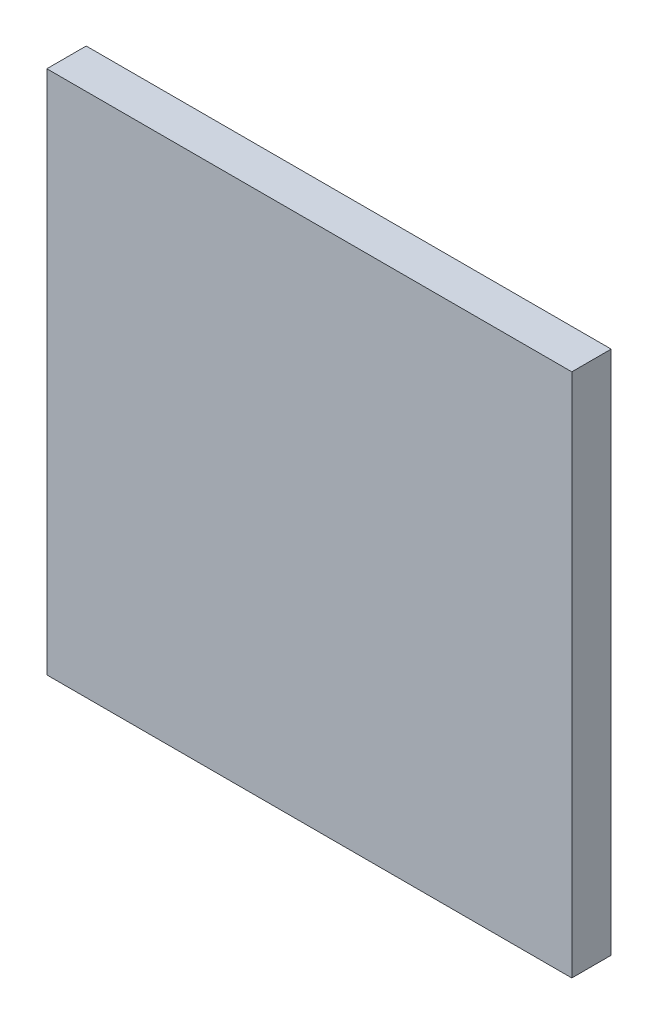
ISO-10303-21;
HEADER;
FILE_DESCRIPTION(('STEP AP214'),'2;1');
FILE_NAME('part.step','',(''),(''),'','','');
FILE_SCHEMA(('AUTOMOTIVE_DESIGN { 1 0 10303 214 1 1 1 1 }'));
ENDSEC;
DATA;
#1=APPLICATION_CONTEXT('core data for automotive mechanical design processes');
#2=APPLICATION_PROTOCOL_DEFINITION('international standard','automotive_design',2000,#1);
#3=PRODUCT_CONTEXT('',#1,'mechanical');
#4=PRODUCT('Part','Part','',(#3));
#5=PRODUCT_RELATED_PRODUCT_CATEGORY('part','',(#4));
#6=PRODUCT_DEFINITION_FORMATION('','',#4);
#7=PRODUCT_DEFINITION_CONTEXT('part definition',#1,'design');
#8=PRODUCT_DEFINITION('design','',#6,#7);
#9=PRODUCT_DEFINITION_SHAPE('','',#8);
#10=(LENGTH_UNIT() NAMED_UNIT(*) SI_UNIT(.MILLI.,.METRE.));
#11=(NAMED_UNIT(*) PLANE_ANGLE_UNIT() SI_UNIT($,.RADIAN.));
#12=(NAMED_UNIT(*) SI_UNIT($,.STERADIAN.) SOLID_ANGLE_UNIT());
#13=UNCERTAINTY_MEASURE_WITH_UNIT(LENGTH_MEASURE(1.E-05),#10,'distance_accuracy_value','');
#14=(GEOMETRIC_REPRESENTATION_CONTEXT(3) GLOBAL_UNCERTAINTY_ASSIGNED_CONTEXT((#13)) GLOBAL_UNIT_ASSIGNED_CONTEXT((#10,
#11,#12)) REPRESENTATION_CONTEXT('',''));
#15=CARTESIAN_POINT('',(0.,0.,0.));
#16=DIRECTION('',(0.,0.,1.));
#17=DIRECTION('',(1.,0.,0.));
#18=AXIS2_PLACEMENT_3D('',#15,#16,#17);
#19=CARTESIAN_POINT('',(100.,-100.,15.));
#20=DIRECTION('',(-1.,0.,0.));
#21=DIRECTION('',(0.,0.,1.));
#22=AXIS2_PLACEMENT_3D('',#19,#20,#21);
#23=PLANE('',#22);
#24=DIRECTION('',(0.,1.,0.));
#25=VECTOR('',#24,1.);
#26=CARTESIAN_POINT('',(100.,-100.,0.));
#27=LINE('',#26,#25);
#28=CARTESIAN_POINT('',(100.,-100.,0.));
#29=VERTEX_POINT('',#28);
#30=CARTESIAN_POINT('',(100.,100.,0.));
#31=VERTEX_POINT('',#30);
#32=EDGE_CURVE('E111',#29,#31,#27,.T.);
#33=ORIENTED_EDGE('',*,*,#32,.T.);
#34=DIRECTION('',(0.,0.,-1.));
#35=VECTOR('',#34,1.);
#36=CARTESIAN_POINT('',(100.,100.,15.));
#37=LINE('',#36,#35);
#38=CARTESIAN_POINT('',(100.,100.,15.));
#39=VERTEX_POINT('',#38);
#40=EDGE_CURVE('E11',#39,#31,#37,.T.);
#41=ORIENTED_EDGE('',*,*,#40,.F.);
#42=DIRECTION('',(0.,1.,0.));
#43=VECTOR('',#42,1.);
#44=CARTESIAN_POINT('',(100.,-100.,15.));
#45=LINE('',#44,#43);
#46=CARTESIAN_POINT('',(100.,-100.,15.));
#47=VERTEX_POINT('',#46);
#48=EDGE_CURVE('E95',#47,#39,#45,.T.);
#49=ORIENTED_EDGE('',*,*,#48,.F.);
#50=DIRECTION('',(0.,0.,-1.));
#51=VECTOR('',#50,1.);
#52=CARTESIAN_POINT('',(100.,-100.,15.));
#53=LINE('',#52,#51);
#54=EDGE_CURVE('E107',#47,#29,#53,.T.);
#55=ORIENTED_EDGE('',*,*,#54,.T.);
#56=EDGE_LOOP('',(#33,#41,#49,#55));
#57=FACE_BOUND('',#56,.T.);
#58=ADVANCED_FACE('F43',(#57),#23,.F.);
#59=CARTESIAN_POINT('',(-100.,100.,15.));
#60=DIRECTION('',(0.,-1.,0.));
#61=DIRECTION('',(0.,0.,-1.));
#62=AXIS2_PLACEMENT_3D('',#59,#60,#61);
#63=PLANE('',#62);
#64=DIRECTION('',(-1.,0.,0.));
#65=VECTOR('',#64,1.);
#66=CARTESIAN_POINT('',(-100.,100.,0.));
#67=LINE('',#66,#65);
#68=CARTESIAN_POINT('',(-100.,100.,0.));
#69=VERTEX_POINT('',#68);
#70=EDGE_CURVE('E100',#31,#69,#67,.T.);
#71=ORIENTED_EDGE('',*,*,#70,.T.);
#72=DIRECTION('',(0.,0.,-1.));
#73=VECTOR('',#72,1.);
#74=CARTESIAN_POINT('',(-100.,100.,15.));
#75=LINE('',#74,#73);
#76=CARTESIAN_POINT('',(-100.,100.,15.));
#77=VERTEX_POINT('',#76);
#78=EDGE_CURVE('E52',#77,#69,#75,.T.);
#79=ORIENTED_EDGE('',*,*,#78,.F.);
#80=DIRECTION('',(-1.,0.,0.));
#81=VECTOR('',#80,1.);
#82=CARTESIAN_POINT('',(-100.,100.,15.));
#83=LINE('',#82,#81);
#84=EDGE_CURVE('E90',#39,#77,#83,.T.);
#85=ORIENTED_EDGE('',*,*,#84,.F.);
#86=ORIENTED_EDGE('',*,*,#40,.T.);
#87=EDGE_LOOP('',(#71,#79,#85,#86));
#88=FACE_BOUND('',#87,.T.);
#89=ADVANCED_FACE('F99',(#88),#63,.F.);
#90=CARTESIAN_POINT('',(-100.,-100.,15.));
#91=DIRECTION('',(1.,0.,0.));
#92=DIRECTION('',(0.,0.,-1.));
#93=AXIS2_PLACEMENT_3D('',#90,#91,#92);
#94=PLANE('',#93);
#95=DIRECTION('',(0.,-1.,0.));
#96=VECTOR('',#95,1.);
#97=CARTESIAN_POINT('',(-100.,-100.,0.));
#98=LINE('',#97,#96);
#99=CARTESIAN_POINT('',(-100.,-100.,0.));
#100=VERTEX_POINT('',#99);
#101=EDGE_CURVE('E77',#69,#100,#98,.T.);
#102=ORIENTED_EDGE('',*,*,#101,.T.);
#103=DIRECTION('',(0.,0.,-1.));
#104=VECTOR('',#103,1.);
#105=CARTESIAN_POINT('',(-100.,-100.,15.));
#106=LINE('',#105,#104);
#107=CARTESIAN_POINT('',(-100.,-100.,15.));
#108=VERTEX_POINT('',#107);
#109=EDGE_CURVE('E102',#108,#100,#106,.T.);
#110=ORIENTED_EDGE('',*,*,#109,.F.);
#111=DIRECTION('',(0.,-1.,0.));
#112=VECTOR('',#111,1.);
#113=CARTESIAN_POINT('',(-100.,-100.,15.));
#114=LINE('',#113,#112);
#115=EDGE_CURVE('E93',#77,#108,#114,.T.);
#116=ORIENTED_EDGE('',*,*,#115,.F.);
#117=ORIENTED_EDGE('',*,*,#78,.T.);
#118=EDGE_LOOP('',(#102,#110,#116,#117));
#119=FACE_BOUND('',#118,.T.);
#120=ADVANCED_FACE('F103',(#119),#94,.F.);
#121=CARTESIAN_POINT('',(-100.,-100.,15.));
#122=DIRECTION('',(0.,1.,0.));
#123=DIRECTION('',(0.,0.,1.));
#124=AXIS2_PLACEMENT_3D('',#121,#122,#123);
#125=PLANE('',#124);
#126=DIRECTION('',(1.,0.,0.));
#127=VECTOR('',#126,1.);
#128=CARTESIAN_POINT('',(-100.,-100.,0.));
#129=LINE('',#128,#127);
#130=EDGE_CURVE('E83',#100,#29,#129,.T.);
#131=ORIENTED_EDGE('',*,*,#130,.T.);
#132=ORIENTED_EDGE('',*,*,#54,.F.);
#133=DIRECTION('',(1.,0.,0.));
#134=VECTOR('',#133,1.);
#135=CARTESIAN_POINT('',(-100.,-100.,15.));
#136=LINE('',#135,#134);
#137=EDGE_CURVE('E60',#108,#47,#136,.T.);
#138=ORIENTED_EDGE('',*,*,#137,.F.);
#139=ORIENTED_EDGE('',*,*,#109,.T.);
#140=EDGE_LOOP('',(#131,#132,#138,#139));
#141=FACE_BOUND('',#140,.T.);
#142=ADVANCED_FACE('F124',(#141),#125,.F.);
#143=CARTESIAN_POINT('',(0.,0.,15.));
#144=DIRECTION('',(0.,0.,-1.));
#145=DIRECTION('',(-1.,0.,0.));
#146=AXIS2_PLACEMENT_3D('',#143,#144,#145);
#147=PLANE('',#146);
#148=ORIENTED_EDGE('',*,*,#48,.T.);
#149=ORIENTED_EDGE('',*,*,#84,.T.);
#150=ORIENTED_EDGE('',*,*,#115,.T.);
#151=ORIENTED_EDGE('',*,*,#137,.T.);
#152=EDGE_LOOP('',(#148,#149,#150,#151));
#153=FACE_BOUND('',#152,.T.);
#154=ADVANCED_FACE('F91',(#153),#147,.F.);
#155=CARTESIAN_POINT('',(0.,0.,0.));
#156=DIRECTION('',(0.,0.,-1.));
#157=DIRECTION('',(-1.,0.,0.));
#158=AXIS2_PLACEMENT_3D('',#155,#156,#157);
#159=PLANE('',#158);
#160=ORIENTED_EDGE('',*,*,#32,.F.);
#161=ORIENTED_EDGE('',*,*,#130,.F.);
#162=ORIENTED_EDGE('',*,*,#101,.F.);
#163=ORIENTED_EDGE('',*,*,#70,.F.);
#164=EDGE_LOOP('',(#160,#161,#162,#163));
#165=FACE_BOUND('',#164,.T.);
#166=ADVANCED_FACE('F127',(#165),#159,.T.);
#167=CLOSED_SHELL('',(#58,#89,#120,#142,#154,#166));
#168=MANIFOLD_SOLID_BREP('B2',#167);
#169=ADVANCED_BREP_SHAPE_REPRESENTATION('',(#18,#168),#14);
#170=SHAPE_DEFINITION_REPRESENTATION(#9,#169);
ENDSEC;
END-ISO-10303-21;
